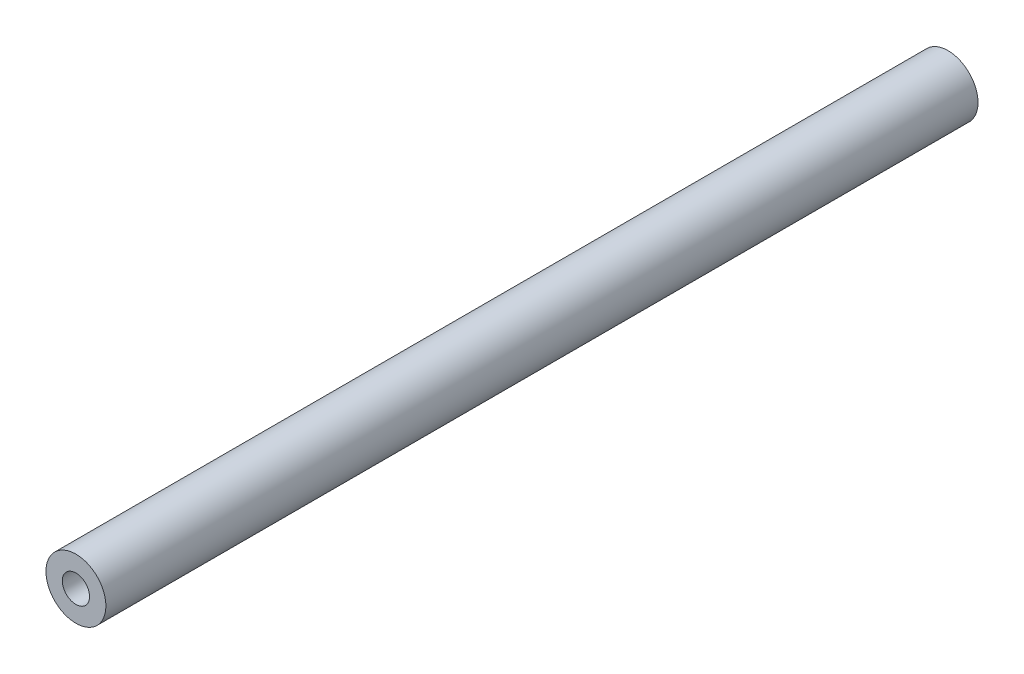
ISO-10303-21;
HEADER;
FILE_DESCRIPTION(('STEP AP214'),'2;1');
FILE_NAME('part.step','',(''),(''),'','','');
FILE_SCHEMA(('AUTOMOTIVE_DESIGN { 1 0 10303 214 1 1 1 1 }'));
ENDSEC;
DATA;
#1=APPLICATION_CONTEXT('core data for automotive mechanical design processes');
#2=APPLICATION_PROTOCOL_DEFINITION('international standard','automotive_design',2000,#1);
#3=PRODUCT_CONTEXT('',#1,'mechanical');
#4=PRODUCT('Part','Part','',(#3));
#5=PRODUCT_RELATED_PRODUCT_CATEGORY('part','',(#4));
#6=PRODUCT_DEFINITION_FORMATION('','',#4);
#7=PRODUCT_DEFINITION_CONTEXT('part definition',#1,'design');
#8=PRODUCT_DEFINITION('design','',#6,#7);
#9=PRODUCT_DEFINITION_SHAPE('','',#8);
#10=(LENGTH_UNIT() NAMED_UNIT(*) SI_UNIT(.MILLI.,.METRE.));
#11=(NAMED_UNIT(*) PLANE_ANGLE_UNIT() SI_UNIT($,.RADIAN.));
#12=(NAMED_UNIT(*) SI_UNIT($,.STERADIAN.) SOLID_ANGLE_UNIT());
#13=UNCERTAINTY_MEASURE_WITH_UNIT(LENGTH_MEASURE(1.E-05),#10,'distance_accuracy_value','');
#14=(GEOMETRIC_REPRESENTATION_CONTEXT(3) GLOBAL_UNCERTAINTY_ASSIGNED_CONTEXT((#13)) GLOBAL_UNIT_ASSIGNED_CONTEXT((#10,
#11,#12)) REPRESENTATION_CONTEXT('',''));
#15=CARTESIAN_POINT('',(0.,0.,0.));
#16=DIRECTION('',(0.,0.,1.));
#17=DIRECTION('',(1.,0.,0.));
#18=AXIS2_PLACEMENT_3D('',#15,#16,#17);
#19=CARTESIAN_POINT('',(0.,0.,-40.));
#20=DIRECTION('',(0.,0.,1.));
#21=DIRECTION('',(1.,0.,0.));
#22=AXIS2_PLACEMENT_3D('',#19,#20,#21);
#23=CYLINDRICAL_SURFACE('',#22,2.75);
#24=CARTESIAN_POINT('',(0.,0.,-40.));
#25=DIRECTION('',(0.,0.,1.));
#26=DIRECTION('',(1.,0.,0.));
#27=AXIS2_PLACEMENT_3D('',#24,#25,#26);
#28=CIRCLE('',#27,2.75);
#29=CARTESIAN_POINT('',(2.75,0.,-40.));
#30=VERTEX_POINT('',#29);
#31=EDGE_CURVE('E10',#30,#30,#28,.T.);
#32=ORIENTED_EDGE('',*,*,#31,.T.);
#33=EDGE_LOOP('',(#32));
#34=FACE_BOUND('',#33,.T.);
#35=CARTESIAN_POINT('',(0.,0.,40.));
#36=DIRECTION('',(0.,0.,1.));
#37=DIRECTION('',(1.,0.,0.));
#38=AXIS2_PLACEMENT_3D('',#35,#36,#37);
#39=CIRCLE('',#38,2.75);
#40=CARTESIAN_POINT('',(2.75,0.,40.));
#41=VERTEX_POINT('',#40);
#42=EDGE_CURVE('E40',#41,#41,#39,.T.);
#43=ORIENTED_EDGE('',*,*,#42,.F.);
#44=EDGE_LOOP('',(#43));
#45=FACE_BOUND('',#44,.T.);
#46=ADVANCED_FACE('F34',(#34,#45),#23,.T.);
#47=CARTESIAN_POINT('',(0.,0.,-40.));
#48=DIRECTION('',(0.,0.,1.));
#49=DIRECTION('',(1.,0.,0.));
#50=AXIS2_PLACEMENT_3D('',#47,#48,#49);
#51=PLANE('',#50);
#52=CARTESIAN_POINT('',(0.,0.,-40.));
#53=DIRECTION('',(0.,0.,-1.));
#54=DIRECTION('',(-1.,0.,0.));
#55=AXIS2_PLACEMENT_3D('',#52,#53,#54);
#56=CIRCLE('',#55,1.25);
#57=CARTESIAN_POINT('',(-1.25,0.,-40.));
#58=VERTEX_POINT('',#57);
#59=EDGE_CURVE('E54',#58,#58,#56,.T.);
#60=ORIENTED_EDGE('',*,*,#59,.F.);
#61=EDGE_LOOP('',(#60));
#62=FACE_BOUND('',#61,.T.);
#63=ORIENTED_EDGE('',*,*,#31,.F.);
#64=EDGE_LOOP('',(#63));
#65=FACE_BOUND('',#64,.T.);
#66=ADVANCED_FACE('F69',(#62,#65),#51,.F.);
#67=CARTESIAN_POINT('',(0.,0.,40.));
#68=DIRECTION('',(0.,0.,1.));
#69=DIRECTION('',(1.,0.,0.));
#70=AXIS2_PLACEMENT_3D('',#67,#68,#69);
#71=PLANE('',#70);
#72=CARTESIAN_POINT('',(0.,0.,40.));
#73=DIRECTION('',(0.,0.,1.));
#74=DIRECTION('',(1.,0.,0.));
#75=AXIS2_PLACEMENT_3D('',#72,#73,#74);
#76=CIRCLE('',#75,1.25);
#77=CARTESIAN_POINT('',(1.25,0.,40.));
#78=VERTEX_POINT('',#77);
#79=EDGE_CURVE('E48',#78,#78,#76,.T.);
#80=ORIENTED_EDGE('',*,*,#79,.F.);
#81=EDGE_LOOP('',(#80));
#82=FACE_BOUND('',#81,.T.);
#83=ORIENTED_EDGE('',*,*,#42,.T.);
#84=EDGE_LOOP('',(#83));
#85=FACE_BOUND('',#84,.T.);
#86=ADVANCED_FACE('F72',(#82,#85),#71,.T.);
#87=CARTESIAN_POINT('',(0.,0.,25.));
#88=DIRECTION('',(0.,0.,1.));
#89=DIRECTION('',(1.,0.,0.));
#90=AXIS2_PLACEMENT_3D('',#87,#88,#89);
#91=CYLINDRICAL_SURFACE('',#90,1.25);
#92=CARTESIAN_POINT('',(0.,0.,25.));
#93=DIRECTION('',(0.,0.,1.));
#94=DIRECTION('',(1.,0.,0.));
#95=AXIS2_PLACEMENT_3D('',#92,#93,#94);
#96=CIRCLE('',#95,1.25);
#97=CARTESIAN_POINT('',(1.25,0.,25.));
#98=VERTEX_POINT('',#97);
#99=EDGE_CURVE('E44',#98,#98,#96,.T.);
#100=ORIENTED_EDGE('',*,*,#99,.F.);
#101=EDGE_LOOP('',(#100));
#102=FACE_BOUND('',#101,.T.);
#103=ORIENTED_EDGE('',*,*,#79,.T.);
#104=EDGE_LOOP('',(#103));
#105=FACE_BOUND('',#104,.T.);
#106=ADVANCED_FACE('F77',(#102,#105),#91,.F.);
#107=CARTESIAN_POINT('',(0.,0.,25.));
#108=DIRECTION('',(0.,0.,1.));
#109=DIRECTION('',(1.,0.,0.));
#110=AXIS2_PLACEMENT_3D('',#107,#108,#109);
#111=PLANE('',#110);
#112=ORIENTED_EDGE('',*,*,#99,.T.);
#113=EDGE_LOOP('',(#112));
#114=FACE_BOUND('',#113,.T.);
#115=ADVANCED_FACE('F65',(#114),#111,.T.);
#116=CARTESIAN_POINT('',(0.,0.,-25.));
#117=DIRECTION('',(0.,0.,-1.));
#118=DIRECTION('',(-1.,0.,0.));
#119=AXIS2_PLACEMENT_3D('',#116,#117,#118);
#120=CYLINDRICAL_SURFACE('',#119,1.25);
#121=CARTESIAN_POINT('',(0.,0.,-25.));
#122=DIRECTION('',(0.,0.,-1.));
#123=DIRECTION('',(-1.,0.,0.));
#124=AXIS2_PLACEMENT_3D('',#121,#122,#123);
#125=CIRCLE('',#124,1.25);
#126=CARTESIAN_POINT('',(-1.25,0.,-25.));
#127=VERTEX_POINT('',#126);
#128=EDGE_CURVE('E52',#127,#127,#125,.T.);
#129=ORIENTED_EDGE('',*,*,#128,.F.);
#130=EDGE_LOOP('',(#129));
#131=FACE_BOUND('',#130,.T.);
#132=ORIENTED_EDGE('',*,*,#59,.T.);
#133=EDGE_LOOP('',(#132));
#134=FACE_BOUND('',#133,.T.);
#135=ADVANCED_FACE('F62',(#131,#134),#120,.F.);
#136=CARTESIAN_POINT('',(0.,0.,-25.));
#137=DIRECTION('',(0.,0.,-1.));
#138=DIRECTION('',(-1.,0.,0.));
#139=AXIS2_PLACEMENT_3D('',#136,#137,#138);
#140=PLANE('',#139);
#141=ORIENTED_EDGE('',*,*,#128,.T.);
#142=EDGE_LOOP('',(#141));
#143=FACE_BOUND('',#142,.T.);
#144=ADVANCED_FACE('F60',(#143),#140,.T.);
#145=CLOSED_SHELL('',(#46,#66,#86,#106,#115,#135,#144));
#146=MANIFOLD_SOLID_BREP('B2',#145);
#147=ADVANCED_BREP_SHAPE_REPRESENTATION('',(#18,#146),#14);
#148=SHAPE_DEFINITION_REPRESENTATION(#9,#147);
ENDSEC;
END-ISO-10303-21;
